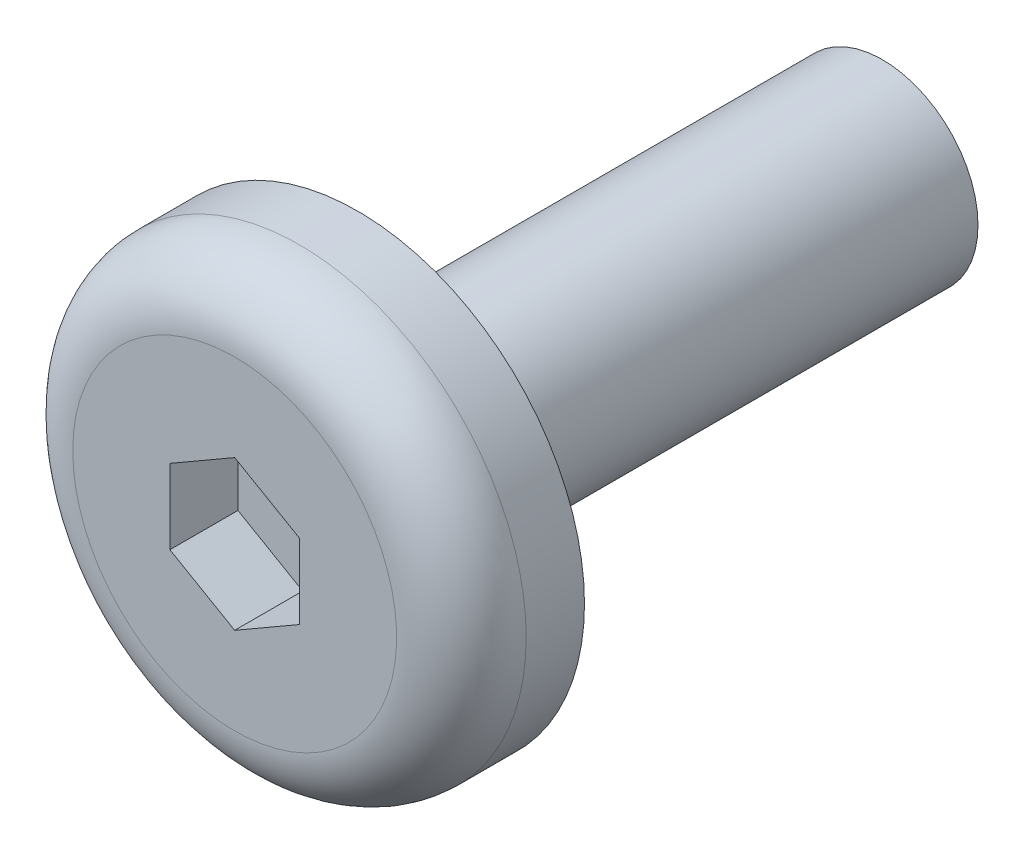
ISO-10303-21;
HEADER;
FILE_DESCRIPTION(('STEP AP214'),'2;1');
FILE_NAME('part.step','',(''),(''),'','','');
FILE_SCHEMA(('AUTOMOTIVE_DESIGN { 1 0 10303 214 1 1 1 1 }'));
ENDSEC;
DATA;
#1=APPLICATION_CONTEXT('core data for automotive mechanical design processes');
#2=APPLICATION_PROTOCOL_DEFINITION('international standard','automotive_design',2000,#1);
#3=PRODUCT_CONTEXT('',#1,'mechanical');
#4=PRODUCT('Part','Part','',(#3));
#5=PRODUCT_RELATED_PRODUCT_CATEGORY('part','',(#4));
#6=PRODUCT_DEFINITION_FORMATION('','',#4);
#7=PRODUCT_DEFINITION_CONTEXT('part definition',#1,'design');
#8=PRODUCT_DEFINITION('design','',#6,#7);
#9=PRODUCT_DEFINITION_SHAPE('','',#8);
#10=(LENGTH_UNIT() NAMED_UNIT(*) SI_UNIT(.MILLI.,.METRE.));
#11=(NAMED_UNIT(*) PLANE_ANGLE_UNIT() SI_UNIT($,.RADIAN.));
#12=(NAMED_UNIT(*) SI_UNIT($,.STERADIAN.) SOLID_ANGLE_UNIT());
#13=UNCERTAINTY_MEASURE_WITH_UNIT(LENGTH_MEASURE(1.E-05),#10,'distance_accuracy_value','');
#14=(GEOMETRIC_REPRESENTATION_CONTEXT(3) GLOBAL_UNCERTAINTY_ASSIGNED_CONTEXT((#13)) GLOBAL_UNIT_ASSIGNED_CONTEXT((#10,
#11,#12)) REPRESENTATION_CONTEXT('',''));
#15=CARTESIAN_POINT('',(0.,0.,0.));
#16=DIRECTION('',(0.,0.,1.));
#17=DIRECTION('',(1.,0.,0.));
#18=AXIS2_PLACEMENT_3D('',#15,#16,#17);
#19=CARTESIAN_POINT('',(0.,3.5,0.));
#20=DIRECTION('',(0.,0.,-1.));
#21=DIRECTION('',(-1.,0.,0.));
#22=AXIS2_PLACEMENT_3D('',#19,#20,#21);
#23=PLANE('',#22);
#24=DIRECTION('',(-0.866025403784439,-0.5,0.));
#25=VECTOR('',#24,1.);
#26=CARTESIAN_POINT('',(0.,1.15470053837925,0.));
#27=LINE('',#26,#25);
#28=CARTESIAN_POINT('',(0.,1.15470053837925,0.));
#29=VERTEX_POINT('',#28);
#30=CARTESIAN_POINT('',(-1.,0.577350269189626,0.));
#31=VERTEX_POINT('',#30);
#32=EDGE_CURVE('E121',#29,#31,#27,.T.);
#33=ORIENTED_EDGE('',*,*,#32,.F.);
#34=DIRECTION('',(-0.866025403784439,0.5,0.));
#35=VECTOR('',#34,1.);
#36=CARTESIAN_POINT('',(1.,0.577350269189626,0.));
#37=LINE('',#36,#35);
#38=CARTESIAN_POINT('',(1.,0.577350269189626,0.));
#39=VERTEX_POINT('',#38);
#40=EDGE_CURVE('E47',#39,#29,#37,.T.);
#41=ORIENTED_EDGE('',*,*,#40,.F.);
#42=DIRECTION('',(0.,1.,0.));
#43=VECTOR('',#42,1.);
#44=CARTESIAN_POINT('',(1.,-0.577350269189626,0.));
#45=LINE('',#44,#43);
#46=CARTESIAN_POINT('',(1.,-0.577350269189626,0.));
#47=VERTEX_POINT('',#46);
#48=EDGE_CURVE('E130',#47,#39,#45,.T.);
#49=ORIENTED_EDGE('',*,*,#48,.F.);
#50=DIRECTION('',(0.866025403784439,0.5,0.));
#51=VECTOR('',#50,1.);
#52=CARTESIAN_POINT('',(0.,-1.15470053837925,0.));
#53=LINE('',#52,#51);
#54=CARTESIAN_POINT('',(0.,-1.15470053837925,0.));
#55=VERTEX_POINT('',#54);
#56=EDGE_CURVE('E128',#55,#47,#53,.T.);
#57=ORIENTED_EDGE('',*,*,#56,.F.);
#58=DIRECTION('',(0.866025403784439,-0.5,0.));
#59=VECTOR('',#58,1.);
#60=CARTESIAN_POINT('',(-1.,-0.577350269189626,0.));
#61=LINE('',#60,#59);
#62=CARTESIAN_POINT('',(-1.,-0.577350269189626,0.));
#63=VERTEX_POINT('',#62);
#64=EDGE_CURVE('E95',#63,#55,#61,.T.);
#65=ORIENTED_EDGE('',*,*,#64,.F.);
#66=DIRECTION('',(0.,-1.,0.));
#67=VECTOR('',#66,1.);
#68=CARTESIAN_POINT('',(-1.,0.577350269189626,0.));
#69=LINE('',#68,#67);
#70=EDGE_CURVE('E124',#31,#63,#69,.T.);
#71=ORIENTED_EDGE('',*,*,#70,.F.);
#72=EDGE_LOOP('',(#33,#41,#49,#57,#65,#71));
#73=FACE_BOUND('',#72,.T.);
#74=CARTESIAN_POINT('',(0.,0.,0.));
#75=DIRECTION('',(0.,0.,-1.));
#76=DIRECTION('',(-1.,0.,0.));
#77=AXIS2_PLACEMENT_3D('',#74,#75,#76);
#78=CIRCLE('',#77,2.5);
#79=CARTESIAN_POINT('',(-2.5,0.,0.));
#80=VERTEX_POINT('',#79);
#81=EDGE_CURVE('E40',#80,#80,#78,.F.);
#82=ORIENTED_EDGE('',*,*,#81,.T.);
#83=EDGE_LOOP('',(#82));
#84=FACE_BOUND('',#83,.T.);
#85=ADVANCED_FACE('F32',(#73,#84),#23,.F.);
#86=CARTESIAN_POINT('',(0.,0.,-10.));
#87=DIRECTION('',(0.,0.,1.));
#88=DIRECTION('',(1.,0.,0.));
#89=AXIS2_PLACEMENT_3D('',#86,#87,#88);
#90=PLANE('',#89);
#91=CARTESIAN_POINT('',(0.,0.,-10.));
#92=DIRECTION('',(0.,0.,1.));
#93=DIRECTION('',(1.,0.,0.));
#94=AXIS2_PLACEMENT_3D('',#91,#92,#93);
#95=CIRCLE('',#94,1.475);
#96=CARTESIAN_POINT('',(1.475,0.,-10.));
#97=VERTEX_POINT('',#96);
#98=EDGE_CURVE('E145',#97,#97,#95,.T.);
#99=ORIENTED_EDGE('',*,*,#98,.F.);
#100=EDGE_LOOP('',(#99));
#101=FACE_BOUND('',#100,.T.);
#102=ADVANCED_FACE('F166',(#101),#90,.F.);
#103=CARTESIAN_POINT('',(0.,0.,0.));
#104=DIRECTION('',(0.,0.,1.));
#105=DIRECTION('',(1.,0.,0.));
#106=AXIS2_PLACEMENT_3D('',#103,#104,#105);
#107=CYLINDRICAL_SURFACE('',#106,1.475);
#108=CARTESIAN_POINT('',(0.,0.,-1.9));
#109=DIRECTION('',(0.,0.,1.));
#110=DIRECTION('',(1.,0.,0.));
#111=AXIS2_PLACEMENT_3D('',#108,#109,#110);
#112=CIRCLE('',#111,1.475);
#113=CARTESIAN_POINT('',(1.475,0.,-1.9));
#114=VERTEX_POINT('',#113);
#115=EDGE_CURVE('E142',#114,#114,#112,.T.);
#116=ORIENTED_EDGE('',*,*,#115,.F.);
#117=EDGE_LOOP('',(#116));
#118=FACE_BOUND('',#117,.T.);
#119=ORIENTED_EDGE('',*,*,#98,.T.);
#120=EDGE_LOOP('',(#119));
#121=FACE_BOUND('',#120,.T.);
#122=ADVANCED_FACE('F171',(#118,#121),#107,.T.);
#123=CARTESIAN_POINT('',(0.,1.475,-1.9));
#124=DIRECTION('',(0.,0.,1.));
#125=DIRECTION('',(1.,0.,0.));
#126=AXIS2_PLACEMENT_3D('',#123,#124,#125);
#127=PLANE('',#126);
#128=CARTESIAN_POINT('',(0.,0.,-1.9));
#129=DIRECTION('',(0.,0.,1.));
#130=DIRECTION('',(1.,0.,0.));
#131=AXIS2_PLACEMENT_3D('',#128,#129,#130);
#132=CIRCLE('',#131,3.5);
#133=CARTESIAN_POINT('',(3.5,0.,-1.9));
#134=VERTEX_POINT('',#133);
#135=EDGE_CURVE('E134',#134,#134,#132,.T.);
#136=ORIENTED_EDGE('',*,*,#135,.F.);
#137=EDGE_LOOP('',(#136));
#138=FACE_BOUND('',#137,.T.);
#139=ORIENTED_EDGE('',*,*,#115,.T.);
#140=EDGE_LOOP('',(#139));
#141=FACE_BOUND('',#140,.T.);
#142=ADVANCED_FACE('F161',(#138,#141),#127,.F.);
#143=CARTESIAN_POINT('',(0.,0.,0.));
#144=DIRECTION('',(0.,0.,1.));
#145=DIRECTION('',(1.,0.,0.));
#146=AXIS2_PLACEMENT_3D('',#143,#144,#145);
#147=CYLINDRICAL_SURFACE('',#146,3.5);
#148=CARTESIAN_POINT('',(0.,0.,-1.));
#149=DIRECTION('',(0.,0.,-1.));
#150=DIRECTION('',(-1.,0.,0.));
#151=AXIS2_PLACEMENT_3D('',#148,#149,#150);
#152=CIRCLE('',#151,3.5);
#153=CARTESIAN_POINT('',(-3.5,0.,-1.));
#154=VERTEX_POINT('',#153);
#155=EDGE_CURVE('E11',#154,#154,#152,.T.);
#156=ORIENTED_EDGE('',*,*,#155,.T.);
#157=EDGE_LOOP('',(#156));
#158=FACE_BOUND('',#157,.T.);
#159=ORIENTED_EDGE('',*,*,#135,.T.);
#160=EDGE_LOOP('',(#159));
#161=FACE_BOUND('',#160,.T.);
#162=ADVANCED_FACE('F153',(#158,#161),#147,.T.);
#163=CARTESIAN_POINT('',(0.,0.,-1.));
#164=DIRECTION('',(0.,0.,-1.));
#165=DIRECTION('',(-1.,0.,0.));
#166=AXIS2_PLACEMENT_3D('',#163,#164,#165);
#167=TOROIDAL_SURFACE('',#166,2.5,1.);
#168=ORIENTED_EDGE('',*,*,#155,.F.);
#169=EDGE_LOOP('',(#168));
#170=FACE_BOUND('',#169,.T.);
#171=ORIENTED_EDGE('',*,*,#81,.F.);
#172=EDGE_LOOP('',(#171));
#173=FACE_BOUND('',#172,.T.);
#174=ADVANCED_FACE('F34',(#170,#173),#167,.T.);
#175=CARTESIAN_POINT('',(1.,0.577350269189626,-1.05));
#176=DIRECTION('',(0.5,0.866025403784439,0.));
#177=DIRECTION('',(-0.866025403784439,0.5,0.));
#178=AXIS2_PLACEMENT_3D('',#175,#176,#177);
#179=PLANE('',#178);
#180=ORIENTED_EDGE('',*,*,#40,.T.);
#181=DIRECTION('',(0.,0.,1.));
#182=VECTOR('',#181,1.);
#183=CARTESIAN_POINT('',(0.,1.15470053837925,-1.05));
#184=LINE('',#183,#182);
#185=CARTESIAN_POINT('',(0.,1.15470053837925,-1.05));
#186=VERTEX_POINT('',#185);
#187=EDGE_CURVE('E77',#186,#29,#184,.T.);
#188=ORIENTED_EDGE('',*,*,#187,.F.);
#189=DIRECTION('',(-0.866025403784439,0.5,0.));
#190=VECTOR('',#189,1.);
#191=CARTESIAN_POINT('',(1.,0.577350269189626,-1.05));
#192=LINE('',#191,#190);
#193=CARTESIAN_POINT('',(1.,0.577350269189626,-1.05));
#194=VERTEX_POINT('',#193);
#195=EDGE_CURVE('E132',#194,#186,#192,.T.);
#196=ORIENTED_EDGE('',*,*,#195,.F.);
#197=DIRECTION('',(0.,0.,1.));
#198=VECTOR('',#197,1.);
#199=CARTESIAN_POINT('',(1.,0.577350269189626,-1.05));
#200=LINE('',#199,#198);
#201=EDGE_CURVE('E55',#194,#39,#200,.T.);
#202=ORIENTED_EDGE('',*,*,#201,.T.);
#203=EDGE_LOOP('',(#180,#188,#196,#202));
#204=FACE_BOUND('',#203,.T.);
#205=ADVANCED_FACE('F152',(#204),#179,.F.);
#206=CARTESIAN_POINT('',(1.,-0.577350269189626,-1.05));
#207=DIRECTION('',(1.,0.,0.));
#208=DIRECTION('',(0.,1.,0.));
#209=AXIS2_PLACEMENT_3D('',#206,#207,#208);
#210=PLANE('',#209);
#211=ORIENTED_EDGE('',*,*,#48,.T.);
#212=ORIENTED_EDGE('',*,*,#201,.F.);
#213=DIRECTION('',(0.,1.,0.));
#214=VECTOR('',#213,1.);
#215=CARTESIAN_POINT('',(1.,-0.577350269189626,-1.05));
#216=LINE('',#215,#214);
#217=CARTESIAN_POINT('',(1.,-0.577350269189626,-1.05));
#218=VERTEX_POINT('',#217);
#219=EDGE_CURVE('E107',#218,#194,#216,.T.);
#220=ORIENTED_EDGE('',*,*,#219,.F.);
#221=DIRECTION('',(0.,0.,1.));
#222=VECTOR('',#221,1.);
#223=CARTESIAN_POINT('',(1.,-0.577350269189626,-1.05));
#224=LINE('',#223,#222);
#225=EDGE_CURVE('E99',#218,#47,#224,.T.);
#226=ORIENTED_EDGE('',*,*,#225,.T.);
#227=EDGE_LOOP('',(#211,#212,#220,#226));
#228=FACE_BOUND('',#227,.T.);
#229=ADVANCED_FACE('F159',(#228),#210,.F.);
#230=CARTESIAN_POINT('',(0.,-1.15470053837925,-1.05));
#231=DIRECTION('',(0.5,-0.866025403784439,0.));
#232=DIRECTION('',(0.866025403784439,0.5,0.));
#233=AXIS2_PLACEMENT_3D('',#230,#231,#232);
#234=PLANE('',#233);
#235=ORIENTED_EDGE('',*,*,#56,.T.);
#236=ORIENTED_EDGE('',*,*,#225,.F.);
#237=DIRECTION('',(0.866025403784439,0.5,0.));
#238=VECTOR('',#237,1.);
#239=CARTESIAN_POINT('',(0.,-1.15470053837925,-1.05));
#240=LINE('',#239,#238);
#241=CARTESIAN_POINT('',(0.,-1.15470053837925,-1.05));
#242=VERTEX_POINT('',#241);
#243=EDGE_CURVE('E103',#242,#218,#240,.T.);
#244=ORIENTED_EDGE('',*,*,#243,.F.);
#245=DIRECTION('',(0.,0.,1.));
#246=VECTOR('',#245,1.);
#247=CARTESIAN_POINT('',(0.,-1.15470053837925,-1.05));
#248=LINE('',#247,#246);
#249=EDGE_CURVE('E88',#242,#55,#248,.T.);
#250=ORIENTED_EDGE('',*,*,#249,.T.);
#251=EDGE_LOOP('',(#235,#236,#244,#250));
#252=FACE_BOUND('',#251,.T.);
#253=ADVANCED_FACE('F104',(#252),#234,.F.);
#254=CARTESIAN_POINT('',(-1.,-0.577350269189626,-1.05));
#255=DIRECTION('',(-0.5,-0.866025403784439,0.));
#256=DIRECTION('',(0.866025403784439,-0.5,0.));
#257=AXIS2_PLACEMENT_3D('',#254,#255,#256);
#258=PLANE('',#257);
#259=ORIENTED_EDGE('',*,*,#64,.T.);
#260=ORIENTED_EDGE('',*,*,#249,.F.);
#261=DIRECTION('',(0.866025403784439,-0.5,0.));
#262=VECTOR('',#261,1.);
#263=CARTESIAN_POINT('',(-1.,-0.577350269189626,-1.05));
#264=LINE('',#263,#262);
#265=CARTESIAN_POINT('',(-1.,-0.577350269189626,-1.05));
#266=VERTEX_POINT('',#265);
#267=EDGE_CURVE('E92',#266,#242,#264,.T.);
#268=ORIENTED_EDGE('',*,*,#267,.F.);
#269=DIRECTION('',(0.,0.,1.));
#270=VECTOR('',#269,1.);
#271=CARTESIAN_POINT('',(-1.,-0.577350269189626,-1.05));
#272=LINE('',#271,#270);
#273=EDGE_CURVE('E100',#266,#63,#272,.T.);
#274=ORIENTED_EDGE('',*,*,#273,.T.);
#275=EDGE_LOOP('',(#259,#260,#268,#274));
#276=FACE_BOUND('',#275,.T.);
#277=ADVANCED_FACE('F90',(#276),#258,.F.);
#278=CARTESIAN_POINT('',(-1.,0.577350269189626,-1.05));
#279=DIRECTION('',(-1.,0.,0.));
#280=DIRECTION('',(0.,-1.,0.));
#281=AXIS2_PLACEMENT_3D('',#278,#279,#280);
#282=PLANE('',#281);
#283=ORIENTED_EDGE('',*,*,#70,.T.);
#284=ORIENTED_EDGE('',*,*,#273,.F.);
#285=DIRECTION('',(0.,-1.,0.));
#286=VECTOR('',#285,1.);
#287=CARTESIAN_POINT('',(-1.,0.577350269189626,-1.05));
#288=LINE('',#287,#286);
#289=CARTESIAN_POINT('',(-1.,0.577350269189626,-1.05));
#290=VERTEX_POINT('',#289);
#291=EDGE_CURVE('E113',#290,#266,#288,.T.);
#292=ORIENTED_EDGE('',*,*,#291,.F.);
#293=DIRECTION('',(0.,0.,1.));
#294=VECTOR('',#293,1.);
#295=CARTESIAN_POINT('',(-1.,0.577350269189626,-1.05));
#296=LINE('',#295,#294);
#297=EDGE_CURVE('E137',#290,#31,#296,.T.);
#298=ORIENTED_EDGE('',*,*,#297,.T.);
#299=EDGE_LOOP('',(#283,#284,#292,#298));
#300=FACE_BOUND('',#299,.T.);
#301=ADVANCED_FACE('F185',(#300),#282,.F.);
#302=CARTESIAN_POINT('',(0.,1.15470053837925,-1.05));
#303=DIRECTION('',(-0.5,0.866025403784439,0.));
#304=DIRECTION('',(-0.866025403784439,-0.5,0.));
#305=AXIS2_PLACEMENT_3D('',#302,#303,#304);
#306=PLANE('',#305);
#307=ORIENTED_EDGE('',*,*,#32,.T.);
#308=ORIENTED_EDGE('',*,*,#297,.F.);
#309=DIRECTION('',(-0.866025403784439,-0.5,0.));
#310=VECTOR('',#309,1.);
#311=CARTESIAN_POINT('',(0.,1.15470053837925,-1.05));
#312=LINE('',#311,#310);
#313=EDGE_CURVE('E115',#186,#290,#312,.T.);
#314=ORIENTED_EDGE('',*,*,#313,.F.);
#315=ORIENTED_EDGE('',*,*,#187,.T.);
#316=EDGE_LOOP('',(#307,#308,#314,#315));
#317=FACE_BOUND('',#316,.T.);
#318=ADVANCED_FACE('F182',(#317),#306,.F.);
#319=CARTESIAN_POINT('',(0.,0.,-1.05));
#320=DIRECTION('',(0.,0.,1.));
#321=DIRECTION('',(1.,0.,0.));
#322=AXIS2_PLACEMENT_3D('',#319,#320,#321);
#323=PLANE('',#322);
#324=ORIENTED_EDGE('',*,*,#195,.T.);
#325=ORIENTED_EDGE('',*,*,#313,.T.);
#326=ORIENTED_EDGE('',*,*,#291,.T.);
#327=ORIENTED_EDGE('',*,*,#267,.T.);
#328=ORIENTED_EDGE('',*,*,#243,.T.);
#329=ORIENTED_EDGE('',*,*,#219,.T.);
#330=EDGE_LOOP('',(#324,#325,#326,#327,#328,#329));
#331=FACE_BOUND('',#330,.T.);
#332=ADVANCED_FACE('F110',(#331),#323,.T.);
#333=CLOSED_SHELL('',(#85,#102,#122,#142,#162,#174,#205,#229,#253,#277,#301,#318,#332));
#334=MANIFOLD_SOLID_BREP('B2',#333);
#335=ADVANCED_BREP_SHAPE_REPRESENTATION('',(#18,#334),#14);
#336=SHAPE_DEFINITION_REPRESENTATION(#9,#335);
ENDSEC;
END-ISO-10303-21;
